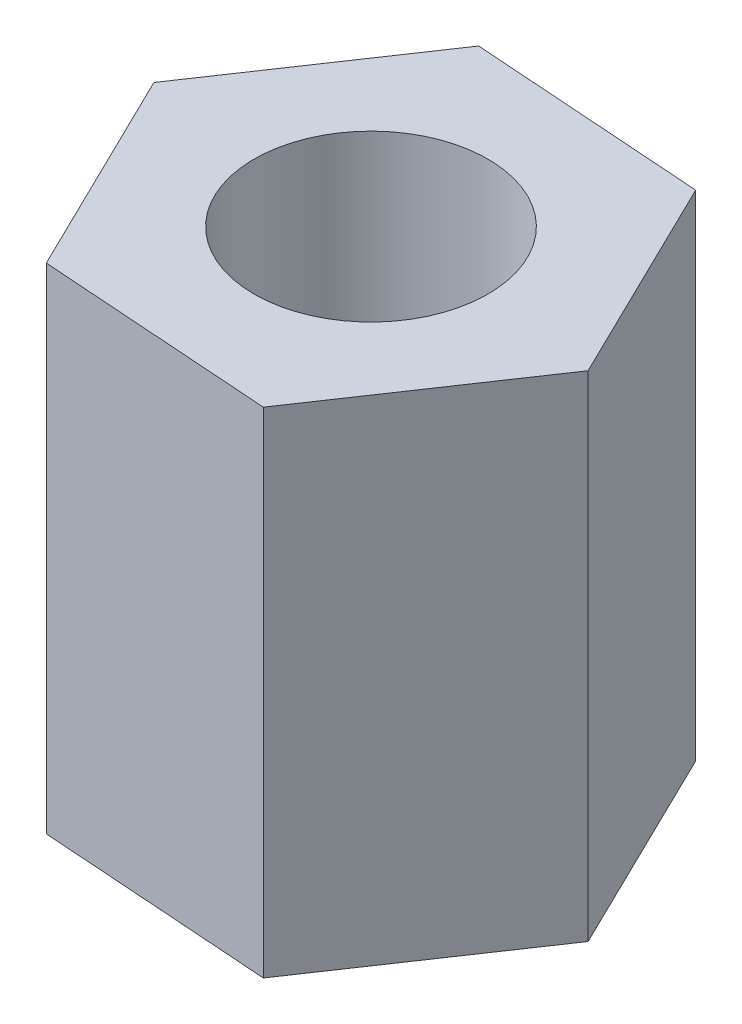
ISO-10303-21;
HEADER;
FILE_DESCRIPTION(('STEP AP214'),'2;1');
FILE_NAME('part.step','',(''),(''),'','','');
FILE_SCHEMA(('AUTOMOTIVE_DESIGN { 1 0 10303 214 1 1 1 1 }'));
ENDSEC;
DATA;
#1=APPLICATION_CONTEXT('core data for automotive mechanical design processes');
#2=APPLICATION_PROTOCOL_DEFINITION('international standard','automotive_design',2000,#1);
#3=PRODUCT_CONTEXT('',#1,'mechanical');
#4=PRODUCT('Part','Part','',(#3));
#5=PRODUCT_RELATED_PRODUCT_CATEGORY('part','',(#4));
#6=PRODUCT_DEFINITION_FORMATION('','',#4);
#7=PRODUCT_DEFINITION_CONTEXT('part definition',#1,'design');
#8=PRODUCT_DEFINITION('design','',#6,#7);
#9=PRODUCT_DEFINITION_SHAPE('','',#8);
#10=(LENGTH_UNIT() NAMED_UNIT(*) SI_UNIT(.MILLI.,.METRE.));
#11=(NAMED_UNIT(*) PLANE_ANGLE_UNIT() SI_UNIT($,.RADIAN.));
#12=(NAMED_UNIT(*) SI_UNIT($,.STERADIAN.) SOLID_ANGLE_UNIT());
#13=UNCERTAINTY_MEASURE_WITH_UNIT(LENGTH_MEASURE(1.E-05),#10,'distance_accuracy_value','');
#14=(GEOMETRIC_REPRESENTATION_CONTEXT(3) GLOBAL_UNCERTAINTY_ASSIGNED_CONTEXT((#13)) GLOBAL_UNIT_ASSIGNED_CONTEXT((#10,
#11,#12)) REPRESENTATION_CONTEXT('',''));
#15=CARTESIAN_POINT('',(0.,0.,0.));
#16=DIRECTION('',(0.,0.,1.));
#17=DIRECTION('',(1.,0.,0.));
#18=AXIS2_PLACEMENT_3D('',#15,#16,#17);
#19=CARTESIAN_POINT('',(0.,6.34,0.));
#20=DIRECTION('',(0.,1.,0.));
#21=DIRECTION('',(0.,0.,1.));
#22=AXIS2_PLACEMENT_3D('',#19,#20,#21);
#23=PLANE('',#22);
#24=DIRECTION('',(-0.559069687817486,0.,0.829120669241613));
#25=VECTOR('',#24,1.);
#26=CARTESIAN_POINT('',(-1.31551415537175,6.34,-2.69618666026975));
#27=LINE('',#26,#25);
#28=CARTESIAN_POINT('',(-1.31551415537175,6.34,-2.69618666026975));
#29=VERTEX_POINT('',#28);
#30=CARTESIAN_POINT('',(-2.9927232188242,6.34,-0.208824652544916));
#31=VERTEX_POINT('',#30);
#32=EDGE_CURVE('E146',#29,#31,#27,.T.);
#33=ORIENTED_EDGE('',*,*,#32,.T.);
#34=DIRECTION('',(0.438504718457249,0.,0.898728886756584));
#35=VECTOR('',#34,1.);
#36=CARTESIAN_POINT('',(-2.9927232188242,6.34,-0.208824652544916));
#37=LINE('',#36,#35);
#38=CARTESIAN_POINT('',(-1.67720906345246,6.34,2.48736200772484));
#39=VERTEX_POINT('',#38);
#40=EDGE_CURVE('E94',#31,#39,#37,.T.);
#41=ORIENTED_EDGE('',*,*,#40,.T.);
#42=DIRECTION('',(0.997574406274734,0.,0.069608217514972));
#43=VECTOR('',#42,1.);
#44=CARTESIAN_POINT('',(-1.67720906345246,6.34,2.48736200772484));
#45=LINE('',#44,#43);
#46=CARTESIAN_POINT('',(1.31551415537175,6.34,2.69618666026975));
#47=VERTEX_POINT('',#46);
#48=EDGE_CURVE('E107',#39,#47,#45,.T.);
#49=ORIENTED_EDGE('',*,*,#48,.T.);
#50=DIRECTION('',(0.559069687817485,0.,-0.829120669241612));
#51=VECTOR('',#50,1.);
#52=CARTESIAN_POINT('',(1.31551415537175,6.34,2.69618666026975));
#53=LINE('',#52,#51);
#54=CARTESIAN_POINT('',(2.9927232188242,6.34,0.208824652544916));
#55=VERTEX_POINT('',#54);
#56=EDGE_CURVE('E101',#47,#55,#53,.T.);
#57=ORIENTED_EDGE('',*,*,#56,.T.);
#58=DIRECTION('',(-0.438504718457249,0.,-0.898728886756584));
#59=VECTOR('',#58,1.);
#60=CARTESIAN_POINT('',(2.9927232188242,6.34,0.208824652544916));
#61=LINE('',#60,#59);
#62=CARTESIAN_POINT('',(1.67720906345246,6.34,-2.48736200772484));
#63=VERTEX_POINT('',#62);
#64=EDGE_CURVE('E105',#55,#63,#61,.T.);
#65=ORIENTED_EDGE('',*,*,#64,.T.);
#66=DIRECTION('',(-0.997574406274734,0.,-0.0696082175149719));
#67=VECTOR('',#66,1.);
#68=CARTESIAN_POINT('',(1.67720906345246,6.34,-2.48736200772484));
#69=LINE('',#68,#67);
#70=EDGE_CURVE('E57',#63,#29,#69,.T.);
#71=ORIENTED_EDGE('',*,*,#70,.T.);
#72=EDGE_LOOP('',(#33,#41,#49,#57,#65,#71));
#73=FACE_BOUND('',#72,.T.);
#74=CARTESIAN_POINT('',(0.,6.34,0.));
#75=DIRECTION('',(0.,1.,0.));
#76=DIRECTION('',(0.,0.,1.));
#77=AXIS2_PLACEMENT_3D('',#74,#75,#76);
#78=CIRCLE('',#77,1.5);
#79=CARTESIAN_POINT('',(0.,6.34,1.5));
#80=VERTEX_POINT('',#79);
#81=EDGE_CURVE('E134',#80,#80,#78,.T.);
#82=ORIENTED_EDGE('',*,*,#81,.F.);
#83=EDGE_LOOP('',(#82));
#84=FACE_BOUND('',#83,.T.);
#85=ADVANCED_FACE('F39',(#73,#84),#23,.T.);
#86=CARTESIAN_POINT('',(0.,0.,0.));
#87=DIRECTION('',(0.,1.,0.));
#88=DIRECTION('',(0.,0.,1.));
#89=AXIS2_PLACEMENT_3D('',#86,#87,#88);
#90=PLANE('',#89);
#91=DIRECTION('',(-0.559069687817486,0.,0.829120669241613));
#92=VECTOR('',#91,1.);
#93=CARTESIAN_POINT('',(-1.31551415537175,0.,-2.69618666026975));
#94=LINE('',#93,#92);
#95=CARTESIAN_POINT('',(-1.31551415537175,0.,-2.69618666026975));
#96=VERTEX_POINT('',#95);
#97=CARTESIAN_POINT('',(-2.9927232188242,0.,-0.208824652544916));
#98=VERTEX_POINT('',#97);
#99=EDGE_CURVE('E129',#96,#98,#94,.T.);
#100=ORIENTED_EDGE('',*,*,#99,.F.);
#101=DIRECTION('',(-0.997574406274734,0.,-0.0696082175149719));
#102=VECTOR('',#101,1.);
#103=CARTESIAN_POINT('',(1.67720906345246,0.,-2.48736200772484));
#104=LINE('',#103,#102);
#105=CARTESIAN_POINT('',(1.67720906345246,0.,-2.48736200772484));
#106=VERTEX_POINT('',#105);
#107=EDGE_CURVE('E86',#106,#96,#104,.T.);
#108=ORIENTED_EDGE('',*,*,#107,.F.);
#109=DIRECTION('',(-0.438504718457249,0.,-0.898728886756584));
#110=VECTOR('',#109,1.);
#111=CARTESIAN_POINT('',(2.9927232188242,0.,0.208824652544916));
#112=LINE('',#111,#110);
#113=CARTESIAN_POINT('',(2.9927232188242,0.,0.208824652544916));
#114=VERTEX_POINT('',#113);
#115=EDGE_CURVE('E80',#114,#106,#112,.T.);
#116=ORIENTED_EDGE('',*,*,#115,.F.);
#117=DIRECTION('',(0.559069687817485,0.,-0.829120669241612));
#118=VECTOR('',#117,1.);
#119=CARTESIAN_POINT('',(1.31551415537175,0.,2.69618666026975));
#120=LINE('',#119,#118);
#121=CARTESIAN_POINT('',(1.31551415537175,0.,2.69618666026975));
#122=VERTEX_POINT('',#121);
#123=EDGE_CURVE('E116',#122,#114,#120,.T.);
#124=ORIENTED_EDGE('',*,*,#123,.F.);
#125=DIRECTION('',(0.997574406274734,0.,0.069608217514972));
#126=VECTOR('',#125,1.);
#127=CARTESIAN_POINT('',(-1.67720906345246,0.,2.48736200772484));
#128=LINE('',#127,#126);
#129=CARTESIAN_POINT('',(-1.67720906345246,0.,2.48736200772484));
#130=VERTEX_POINT('',#129);
#131=EDGE_CURVE('E137',#130,#122,#128,.T.);
#132=ORIENTED_EDGE('',*,*,#131,.F.);
#133=DIRECTION('',(0.438504718457249,0.,0.898728886756584));
#134=VECTOR('',#133,1.);
#135=CARTESIAN_POINT('',(-2.9927232188242,0.,-0.208824652544916));
#136=LINE('',#135,#134);
#137=EDGE_CURVE('E133',#98,#130,#136,.T.);
#138=ORIENTED_EDGE('',*,*,#137,.F.);
#139=EDGE_LOOP('',(#100,#108,#116,#124,#132,#138));
#140=FACE_BOUND('',#139,.T.);
#141=CARTESIAN_POINT('',(0.,0.,0.));
#142=DIRECTION('',(0.,1.,0.));
#143=DIRECTION('',(0.,0.,1.));
#144=AXIS2_PLACEMENT_3D('',#141,#142,#143);
#145=CIRCLE('',#144,1.5);
#146=CARTESIAN_POINT('',(0.,0.,1.5));
#147=VERTEX_POINT('',#146);
#148=EDGE_CURVE('E243',#147,#147,#145,.T.);
#149=ORIENTED_EDGE('',*,*,#148,.T.);
#150=EDGE_LOOP('',(#149));
#151=FACE_BOUND('',#150,.T.);
#152=ADVANCED_FACE('F159',(#140,#151),#90,.F.);
#153=CARTESIAN_POINT('',(-1.31551415537175,6.34,-2.69618666026975));
#154=DIRECTION('',(0.829120669241612,0.,0.559069687817485));
#155=DIRECTION('',(0.559069687817486,0.,-0.829120669241613));
#156=AXIS2_PLACEMENT_3D('',#153,#154,#155);
#157=PLANE('',#156);
#158=ORIENTED_EDGE('',*,*,#99,.T.);
#159=DIRECTION('',(0.,-1.,0.));
#160=VECTOR('',#159,1.);
#161=CARTESIAN_POINT('',(-2.9927232188242,6.34,-0.208824652544916));
#162=LINE('',#161,#160);
#163=EDGE_CURVE('E11',#31,#98,#162,.T.);
#164=ORIENTED_EDGE('',*,*,#163,.F.);
#165=ORIENTED_EDGE('',*,*,#32,.F.);
#166=DIRECTION('',(0.,-1.,0.));
#167=VECTOR('',#166,1.);
#168=CARTESIAN_POINT('',(-1.31551415537175,6.34,-2.69618666026975));
#169=LINE('',#168,#167);
#170=EDGE_CURVE('E125',#29,#96,#169,.T.);
#171=ORIENTED_EDGE('',*,*,#170,.T.);
#172=EDGE_LOOP('',(#158,#164,#165,#171));
#173=FACE_BOUND('',#172,.T.);
#174=ADVANCED_FACE('F41',(#173),#157,.F.);
#175=CARTESIAN_POINT('',(-2.9927232188242,6.34,-0.208824652544916));
#176=DIRECTION('',(0.898728886756584,0.,-0.438504718457249));
#177=DIRECTION('',(-0.438504718457249,0.,-0.898728886756584));
#178=AXIS2_PLACEMENT_3D('',#175,#176,#177);
#179=PLANE('',#178);
#180=ORIENTED_EDGE('',*,*,#137,.T.);
#181=DIRECTION('',(0.,-1.,0.));
#182=VECTOR('',#181,1.);
#183=CARTESIAN_POINT('',(-1.67720906345246,6.34,2.48736200772484));
#184=LINE('',#183,#182);
#185=EDGE_CURVE('E49',#39,#130,#184,.T.);
#186=ORIENTED_EDGE('',*,*,#185,.F.);
#187=ORIENTED_EDGE('',*,*,#40,.F.);
#188=ORIENTED_EDGE('',*,*,#163,.T.);
#189=EDGE_LOOP('',(#180,#186,#187,#188));
#190=FACE_BOUND('',#189,.T.);
#191=ADVANCED_FACE('F184',(#190),#179,.F.);
#192=CARTESIAN_POINT('',(-1.67720906345246,6.34,2.48736200772484));
#193=DIRECTION('',(0.069608217514972,0.,-0.997574406274734));
#194=DIRECTION('',(-0.997574406274734,0.,-0.069608217514972));
#195=AXIS2_PLACEMENT_3D('',#192,#193,#194);
#196=PLANE('',#195);
#197=ORIENTED_EDGE('',*,*,#131,.T.);
#198=DIRECTION('',(0.,-1.,0.));
#199=VECTOR('',#198,1.);
#200=CARTESIAN_POINT('',(1.31551415537175,6.34,2.69618666026975));
#201=LINE('',#200,#199);
#202=EDGE_CURVE('E118',#47,#122,#201,.T.);
#203=ORIENTED_EDGE('',*,*,#202,.F.);
#204=ORIENTED_EDGE('',*,*,#48,.F.);
#205=ORIENTED_EDGE('',*,*,#185,.T.);
#206=EDGE_LOOP('',(#197,#203,#204,#205));
#207=FACE_BOUND('',#206,.T.);
#208=ADVANCED_FACE('F156',(#207),#196,.F.);
#209=CARTESIAN_POINT('',(1.31551415537175,6.34,2.69618666026975));
#210=DIRECTION('',(-0.829120669241612,0.,-0.559069687817486));
#211=DIRECTION('',(-0.559069687817486,0.,0.829120669241612));
#212=AXIS2_PLACEMENT_3D('',#209,#210,#211);
#213=PLANE('',#212);
#214=ORIENTED_EDGE('',*,*,#123,.T.);
#215=DIRECTION('',(0.,-1.,0.));
#216=VECTOR('',#215,1.);
#217=CARTESIAN_POINT('',(2.9927232188242,6.34,0.208824652544916));
#218=LINE('',#217,#216);
#219=EDGE_CURVE('E113',#55,#114,#218,.T.);
#220=ORIENTED_EDGE('',*,*,#219,.F.);
#221=ORIENTED_EDGE('',*,*,#56,.F.);
#222=ORIENTED_EDGE('',*,*,#202,.T.);
#223=EDGE_LOOP('',(#214,#220,#221,#222));
#224=FACE_BOUND('',#223,.T.);
#225=ADVANCED_FACE('F114',(#224),#213,.F.);
#226=CARTESIAN_POINT('',(2.9927232188242,6.34,0.208824652544916));
#227=DIRECTION('',(-0.898728886756584,0.,0.438504718457249));
#228=DIRECTION('',(0.438504718457249,0.,0.898728886756584));
#229=AXIS2_PLACEMENT_3D('',#226,#227,#228);
#230=PLANE('',#229);
#231=ORIENTED_EDGE('',*,*,#115,.T.);
#232=DIRECTION('',(0.,-1.,0.));
#233=VECTOR('',#232,1.);
#234=CARTESIAN_POINT('',(1.67720906345246,6.34,-2.48736200772484));
#235=LINE('',#234,#233);
#236=EDGE_CURVE('E119',#63,#106,#235,.T.);
#237=ORIENTED_EDGE('',*,*,#236,.F.);
#238=ORIENTED_EDGE('',*,*,#64,.F.);
#239=ORIENTED_EDGE('',*,*,#219,.T.);
#240=EDGE_LOOP('',(#231,#237,#238,#239));
#241=FACE_BOUND('',#240,.T.);
#242=ADVANCED_FACE('F121',(#241),#230,.F.);
#243=CARTESIAN_POINT('',(1.67720906345246,6.34,-2.48736200772484));
#244=DIRECTION('',(-0.0696082175149718,0.,0.997574406274734));
#245=DIRECTION('',(0.997574406274734,0.,0.0696082175149718));
#246=AXIS2_PLACEMENT_3D('',#243,#244,#245);
#247=PLANE('',#246);
#248=ORIENTED_EDGE('',*,*,#107,.T.);
#249=ORIENTED_EDGE('',*,*,#170,.F.);
#250=ORIENTED_EDGE('',*,*,#70,.F.);
#251=ORIENTED_EDGE('',*,*,#236,.T.);
#252=EDGE_LOOP('',(#248,#249,#250,#251));
#253=FACE_BOUND('',#252,.T.);
#254=ADVANCED_FACE('F164',(#253),#247,.F.);
#255=CARTESIAN_POINT('',(0.,6.34,0.));
#256=DIRECTION('',(0.,-1.,0.));
#257=DIRECTION('',(0.,0.,-1.));
#258=AXIS2_PLACEMENT_3D('',#255,#256,#257);
#259=CYLINDRICAL_SURFACE('',#258,1.5);
#260=ORIENTED_EDGE('',*,*,#81,.T.);
#261=EDGE_LOOP('',(#260));
#262=FACE_BOUND('',#261,.T.);
#263=ORIENTED_EDGE('',*,*,#148,.F.);
#264=EDGE_LOOP('',(#263));
#265=FACE_BOUND('',#264,.T.);
#266=ADVANCED_FACE('F166',(#262,#265),#259,.F.);
#267=CLOSED_SHELL('',(#85,#152,#174,#191,#208,#225,#242,#254,#266));
#268=MANIFOLD_SOLID_BREP('B2',#267);
#269=ADVANCED_BREP_SHAPE_REPRESENTATION('',(#18,#268),#14);
#270=SHAPE_DEFINITION_REPRESENTATION(#9,#269);
ENDSEC;
END-ISO-10303-21;
